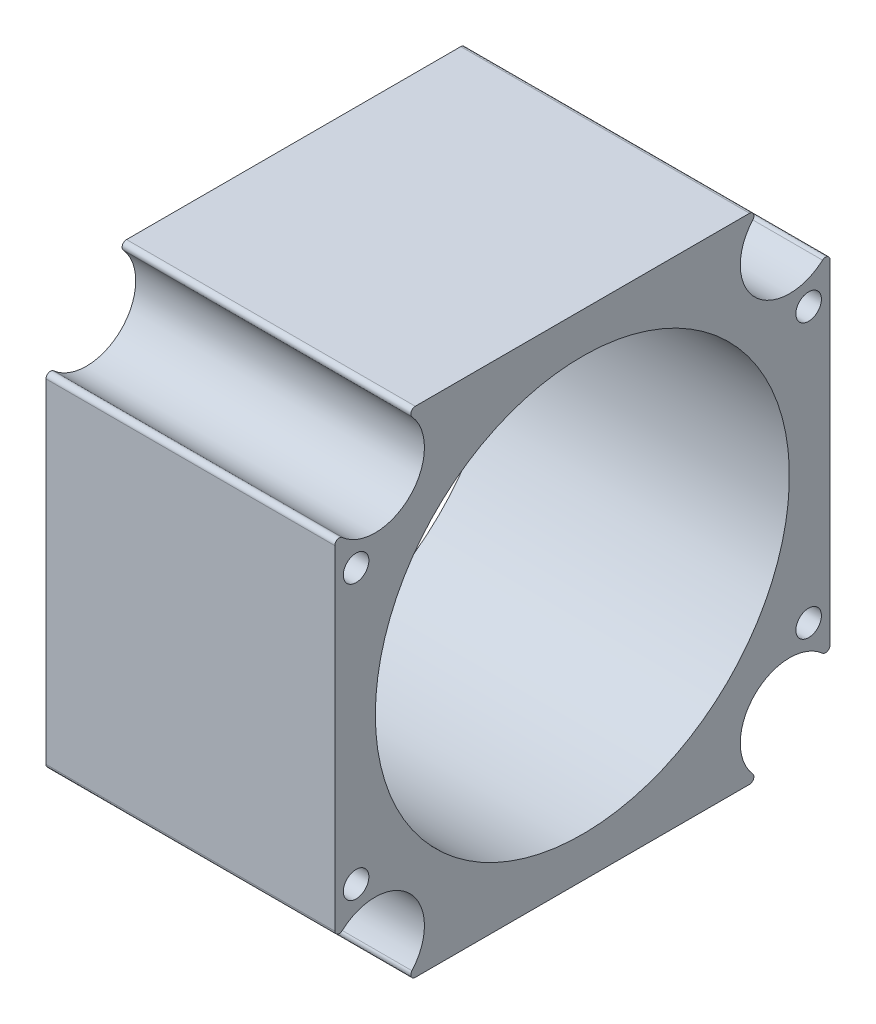
ISO-10303-21;
HEADER;
FILE_DESCRIPTION(('STEP AP214'),'2;1');
FILE_NAME('part.step','',(''),(''),'','','');
FILE_SCHEMA(('AUTOMOTIVE_DESIGN { 1 0 10303 214 1 1 1 1 }'));
ENDSEC;
DATA;
#1=APPLICATION_CONTEXT('core data for automotive mechanical design processes');
#2=APPLICATION_PROTOCOL_DEFINITION('international standard','automotive_design',2000,#1);
#3=PRODUCT_CONTEXT('',#1,'mechanical');
#4=PRODUCT('Part','Part','',(#3));
#5=PRODUCT_RELATED_PRODUCT_CATEGORY('part','',(#4));
#6=PRODUCT_DEFINITION_FORMATION('','',#4);
#7=PRODUCT_DEFINITION_CONTEXT('part definition',#1,'design');
#8=PRODUCT_DEFINITION('design','',#6,#7);
#9=PRODUCT_DEFINITION_SHAPE('','',#8);
#10=(LENGTH_UNIT() NAMED_UNIT(*) SI_UNIT(.MILLI.,.METRE.));
#11=(NAMED_UNIT(*) PLANE_ANGLE_UNIT() SI_UNIT($,.RADIAN.));
#12=(NAMED_UNIT(*) SI_UNIT($,.STERADIAN.) SOLID_ANGLE_UNIT());
#13=UNCERTAINTY_MEASURE_WITH_UNIT(LENGTH_MEASURE(1.E-05),#10,'distance_accuracy_value','');
#14=(GEOMETRIC_REPRESENTATION_CONTEXT(3) GLOBAL_UNCERTAINTY_ASSIGNED_CONTEXT((#13)) GLOBAL_UNIT_ASSIGNED_CONTEXT((#10,
#11,#12)) REPRESENTATION_CONTEXT('',''));
#15=CARTESIAN_POINT('',(0.,0.,0.));
#16=DIRECTION('',(0.,0.,1.));
#17=DIRECTION('',(1.,0.,0.));
#18=AXIS2_PLACEMENT_3D('',#15,#16,#17);
#19=CARTESIAN_POINT('',(32.766,27.559,18.9619096121272));
#20=DIRECTION('',(-1.,0.,0.));
#21=DIRECTION('',(0.,0.,1.));
#22=AXIS2_PLACEMENT_3D('',#19,#20,#21);
#23=CYLINDRICAL_SURFACE('',#22,0.508);
#24=CARTESIAN_POINT('',(0.,27.559,18.9619096121272));
#25=DIRECTION('',(1.,0.,0.));
#26=DIRECTION('',(0.,0.,-1.));
#27=AXIS2_PLACEMENT_3D('',#24,#25,#26);
#28=CIRCLE('',#27,0.508);
#29=CARTESIAN_POINT('',(0.,28.067,18.9619096121272));
#30=VERTEX_POINT('',#29);
#31=CARTESIAN_POINT('',(0.,27.2210374220374,19.3411790360159));
#32=VERTEX_POINT('',#31);
#33=EDGE_CURVE('E184',#30,#32,#28,.T.);
#34=ORIENTED_EDGE('',*,*,#33,.T.);
#35=DIRECTION('',(-1.,0.,0.));
#36=VECTOR('',#35,1.);
#37=CARTESIAN_POINT('',(32.766,27.2210374220374,19.3411790360159));
#38=LINE('',#37,#36);
#39=CARTESIAN_POINT('',(32.766,27.2210374220374,19.3411790360159));
#40=VERTEX_POINT('',#39);
#41=EDGE_CURVE('E11',#40,#32,#38,.T.);
#42=ORIENTED_EDGE('',*,*,#41,.F.);
#43=CARTESIAN_POINT('',(32.766,27.559,18.9619096121272));
#44=DIRECTION('',(1.,0.,0.));
#45=DIRECTION('',(0.,0.,-1.));
#46=AXIS2_PLACEMENT_3D('',#43,#44,#45);
#47=CIRCLE('',#46,0.508);
#48=CARTESIAN_POINT('',(32.766,28.067,18.9619096121272));
#49=VERTEX_POINT('',#48);
#50=EDGE_CURVE('E215',#49,#40,#47,.T.);
#51=ORIENTED_EDGE('',*,*,#50,.F.);
#52=DIRECTION('',(-1.,0.,0.));
#53=VECTOR('',#52,1.);
#54=CARTESIAN_POINT('',(32.766,28.067,18.9619096121272));
#55=LINE('',#54,#53);
#56=EDGE_CURVE('E180',#49,#30,#55,.T.);
#57=ORIENTED_EDGE('',*,*,#56,.T.);
#58=EDGE_LOOP('',(#34,#42,#51,#57));
#59=FACE_BOUND('',#58,.T.);
#60=ADVANCED_FACE('F40',(#59),#23,.T.);
#61=CARTESIAN_POINT('',(32.766,23.495,23.5226244343891));
#62=DIRECTION('',(-1.,0.,0.));
#63=DIRECTION('',(0.,0.,1.));
#64=AXIS2_PLACEMENT_3D('',#61,#62,#63);
#65=CYLINDRICAL_SURFACE('',#64,5.6007);
#66=CARTESIAN_POINT('',(0.,23.495,23.5226244343891));
#67=DIRECTION('',(-1.,0.,0.));
#68=DIRECTION('',(0.,0.,-1.));
#69=AXIS2_PLACEMENT_3D('',#66,#67,#68);
#70=CIRCLE('',#69,5.6007);
#71=CARTESIAN_POINT('',(0.,19.3179515766035,27.2535903895542));
#72=VERTEX_POINT('',#71);
#73=EDGE_CURVE('E187',#32,#72,#70,.T.);
#74=ORIENTED_EDGE('',*,*,#73,.T.);
#75=DIRECTION('',(-1.,0.,0.));
#76=VECTOR('',#75,1.);
#77=CARTESIAN_POINT('',(32.766,19.3179515766035,27.2535903895542));
#78=LINE('',#77,#76);
#79=CARTESIAN_POINT('',(32.766,19.3179515766035,27.2535903895542));
#80=VERTEX_POINT('',#79);
#81=EDGE_CURVE('E48',#80,#72,#78,.T.);
#82=ORIENTED_EDGE('',*,*,#81,.F.);
#83=CARTESIAN_POINT('',(32.766,23.495,23.5226244343891));
#84=DIRECTION('',(-1.,0.,0.));
#85=DIRECTION('',(0.,0.,-1.));
#86=AXIS2_PLACEMENT_3D('',#83,#84,#85);
#87=CIRCLE('',#86,5.6007);
#88=EDGE_CURVE('E123',#40,#80,#87,.T.);
#89=ORIENTED_EDGE('',*,*,#88,.F.);
#90=ORIENTED_EDGE('',*,*,#41,.T.);
#91=EDGE_LOOP('',(#74,#82,#89,#90));
#92=FACE_BOUND('',#91,.T.);
#93=ADVANCED_FACE('F314',(#92),#65,.F.);
#94=CARTESIAN_POINT('',(32.766,18.9390809713067,27.592));
#95=DIRECTION('',(-1.,0.,0.));
#96=DIRECTION('',(0.,0.,1.));
#97=AXIS2_PLACEMENT_3D('',#94,#95,#96);
#98=CYLINDRICAL_SURFACE('',#97,0.508000000000001);
#99=CARTESIAN_POINT('',(0.,18.9390809713067,27.592));
#100=DIRECTION('',(1.,0.,0.));
#101=DIRECTION('',(0.,0.,1.));
#102=AXIS2_PLACEMENT_3D('',#99,#100,#101);
#103=CIRCLE('',#102,0.508000000000001);
#104=CARTESIAN_POINT('',(0.,18.9390809713067,28.1));
#105=VERTEX_POINT('',#104);
#106=EDGE_CURVE('E190',#72,#105,#103,.T.);
#107=ORIENTED_EDGE('',*,*,#106,.T.);
#108=DIRECTION('',(-1.,0.,0.));
#109=VECTOR('',#108,1.);
#110=CARTESIAN_POINT('',(32.766,18.9390809713067,28.1));
#111=LINE('',#110,#109);
#112=CARTESIAN_POINT('',(32.766,18.9390809713067,28.1));
#113=VERTEX_POINT('',#112);
#114=EDGE_CURVE('E246',#113,#105,#111,.T.);
#115=ORIENTED_EDGE('',*,*,#114,.F.);
#116=CARTESIAN_POINT('',(32.766,18.9390809713067,27.592));
#117=DIRECTION('',(1.,0.,0.));
#118=DIRECTION('',(0.,0.,1.));
#119=AXIS2_PLACEMENT_3D('',#116,#117,#118);
#120=CIRCLE('',#119,0.508000000000001);
#121=EDGE_CURVE('E254',#80,#113,#120,.T.);
#122=ORIENTED_EDGE('',*,*,#121,.F.);
#123=ORIENTED_EDGE('',*,*,#81,.T.);
#124=EDGE_LOOP('',(#107,#115,#122,#123));
#125=FACE_BOUND('',#124,.T.);
#126=ADVANCED_FACE('F252',(#125),#98,.T.);
#127=CARTESIAN_POINT('',(32.766,-18.9390809713067,28.1));
#128=DIRECTION('',(0.,0.,-1.));
#129=DIRECTION('',(0.,1.,0.));
#130=AXIS2_PLACEMENT_3D('',#127,#128,#129);
#131=PLANE('',#130);
#132=DIRECTION('',(0.,-1.,0.));
#133=VECTOR('',#132,1.);
#134=CARTESIAN_POINT('',(0.,-18.9390809713067,28.1));
#135=LINE('',#134,#133);
#136=CARTESIAN_POINT('',(0.,-18.9390809713067,28.1));
#137=VERTEX_POINT('',#136);
#138=EDGE_CURVE('E192',#105,#137,#135,.T.);
#139=ORIENTED_EDGE('',*,*,#138,.T.);
#140=DIRECTION('',(-1.,0.,0.));
#141=VECTOR('',#140,1.);
#142=CARTESIAN_POINT('',(32.766,-18.9390809713067,28.1));
#143=LINE('',#142,#141);
#144=CARTESIAN_POINT('',(32.766,-18.9390809713067,28.1));
#145=VERTEX_POINT('',#144);
#146=EDGE_CURVE('E243',#145,#137,#143,.T.);
#147=ORIENTED_EDGE('',*,*,#146,.F.);
#148=DIRECTION('',(0.,-1.,0.));
#149=VECTOR('',#148,1.);
#150=CARTESIAN_POINT('',(32.766,-18.9390809713067,28.1));
#151=LINE('',#150,#149);
#152=EDGE_CURVE('E272',#113,#145,#151,.T.);
#153=ORIENTED_EDGE('',*,*,#152,.F.);
#154=ORIENTED_EDGE('',*,*,#114,.T.);
#155=EDGE_LOOP('',(#139,#147,#153,#154));
#156=FACE_BOUND('',#155,.T.);
#157=ADVANCED_FACE('F263',(#156),#131,.F.);
#158=CARTESIAN_POINT('',(32.766,-18.9390809713067,27.592));
#159=DIRECTION('',(-1.,0.,0.));
#160=DIRECTION('',(0.,0.,1.));
#161=AXIS2_PLACEMENT_3D('',#158,#159,#160);
#162=CYLINDRICAL_SURFACE('',#161,0.508000000000001);
#163=CARTESIAN_POINT('',(0.,-18.9390809713067,27.592));
#164=DIRECTION('',(1.,0.,0.));
#165=DIRECTION('',(0.,0.,-1.));
#166=AXIS2_PLACEMENT_3D('',#163,#164,#165);
#167=CIRCLE('',#166,0.508000000000001);
#168=CARTESIAN_POINT('',(0.,-19.3179515766035,27.2535903895542));
#169=VERTEX_POINT('',#168);
#170=EDGE_CURVE('E194',#137,#169,#167,.T.);
#171=ORIENTED_EDGE('',*,*,#170,.T.);
#172=DIRECTION('',(-1.,0.,0.));
#173=VECTOR('',#172,1.);
#174=CARTESIAN_POINT('',(32.766,-19.3179515766035,27.2535903895542));
#175=LINE('',#174,#173);
#176=CARTESIAN_POINT('',(32.766,-19.3179515766035,27.2535903895542));
#177=VERTEX_POINT('',#176);
#178=EDGE_CURVE('E240',#177,#169,#175,.T.);
#179=ORIENTED_EDGE('',*,*,#178,.F.);
#180=CARTESIAN_POINT('',(32.766,-18.9390809713067,27.592));
#181=DIRECTION('',(1.,0.,0.));
#182=DIRECTION('',(0.,0.,-1.));
#183=AXIS2_PLACEMENT_3D('',#180,#181,#182);
#184=CIRCLE('',#183,0.508000000000001);
#185=EDGE_CURVE('E269',#145,#177,#184,.T.);
#186=ORIENTED_EDGE('',*,*,#185,.F.);
#187=ORIENTED_EDGE('',*,*,#146,.T.);
#188=EDGE_LOOP('',(#171,#179,#186,#187));
#189=FACE_BOUND('',#188,.T.);
#190=ADVANCED_FACE('F267',(#189),#162,.T.);
#191=CARTESIAN_POINT('',(32.766,-23.495,23.5226244343891));
#192=DIRECTION('',(-1.,0.,0.));
#193=DIRECTION('',(0.,0.,1.));
#194=AXIS2_PLACEMENT_3D('',#191,#192,#193);
#195=CYLINDRICAL_SURFACE('',#194,5.6007);
#196=CARTESIAN_POINT('',(0.,-23.495,23.5226244343891));
#197=DIRECTION('',(-1.,0.,0.));
#198=DIRECTION('',(0.,0.,1.));
#199=AXIS2_PLACEMENT_3D('',#196,#197,#198);
#200=CIRCLE('',#199,5.6007);
#201=CARTESIAN_POINT('',(0.,-27.2210374220374,19.3411790360159));
#202=VERTEX_POINT('',#201);
#203=EDGE_CURVE('E196',#169,#202,#200,.T.);
#204=ORIENTED_EDGE('',*,*,#203,.T.);
#205=DIRECTION('',(-1.,0.,0.));
#206=VECTOR('',#205,1.);
#207=CARTESIAN_POINT('',(32.766,-27.2210374220374,19.3411790360159));
#208=LINE('',#207,#206);
#209=CARTESIAN_POINT('',(32.766,-27.2210374220374,19.3411790360159));
#210=VERTEX_POINT('',#209);
#211=EDGE_CURVE('E237',#210,#202,#208,.T.);
#212=ORIENTED_EDGE('',*,*,#211,.F.);
#213=CARTESIAN_POINT('',(32.766,-23.495,23.5226244343891));
#214=DIRECTION('',(-1.,0.,0.));
#215=DIRECTION('',(0.,0.,1.));
#216=AXIS2_PLACEMENT_3D('',#213,#214,#215);
#217=CIRCLE('',#216,5.6007);
#218=EDGE_CURVE('E271',#177,#210,#217,.T.);
#219=ORIENTED_EDGE('',*,*,#218,.F.);
#220=ORIENTED_EDGE('',*,*,#178,.T.);
#221=EDGE_LOOP('',(#204,#212,#219,#220));
#222=FACE_BOUND('',#221,.T.);
#223=ADVANCED_FACE('F327',(#222),#195,.F.);
#224=CARTESIAN_POINT('',(32.766,-27.559,18.9619096121272));
#225=DIRECTION('',(-1.,0.,0.));
#226=DIRECTION('',(0.,0.,1.));
#227=AXIS2_PLACEMENT_3D('',#224,#225,#226);
#228=CYLINDRICAL_SURFACE('',#227,0.508);
#229=CARTESIAN_POINT('',(0.,-27.559,18.9619096121272));
#230=DIRECTION('',(1.,0.,0.));
#231=DIRECTION('',(0.,0.,1.));
#232=AXIS2_PLACEMENT_3D('',#229,#230,#231);
#233=CIRCLE('',#232,0.508);
#234=CARTESIAN_POINT('',(0.,-28.067,18.9619096121272));
#235=VERTEX_POINT('',#234);
#236=EDGE_CURVE('E198',#202,#235,#233,.T.);
#237=ORIENTED_EDGE('',*,*,#236,.T.);
#238=DIRECTION('',(-1.,0.,0.));
#239=VECTOR('',#238,1.);
#240=CARTESIAN_POINT('',(32.766,-28.067,18.9619096121272));
#241=LINE('',#240,#239);
#242=CARTESIAN_POINT('',(32.766,-28.067,18.9619096121272));
#243=VERTEX_POINT('',#242);
#244=EDGE_CURVE('E234',#243,#235,#241,.T.);
#245=ORIENTED_EDGE('',*,*,#244,.F.);
#246=CARTESIAN_POINT('',(32.766,-27.559,18.9619096121272));
#247=DIRECTION('',(1.,0.,0.));
#248=DIRECTION('',(0.,0.,1.));
#249=AXIS2_PLACEMENT_3D('',#246,#247,#248);
#250=CIRCLE('',#249,0.508);
#251=EDGE_CURVE('E274',#210,#243,#250,.T.);
#252=ORIENTED_EDGE('',*,*,#251,.F.);
#253=ORIENTED_EDGE('',*,*,#211,.T.);
#254=EDGE_LOOP('',(#237,#245,#252,#253));
#255=FACE_BOUND('',#254,.T.);
#256=ADVANCED_FACE('F330',(#255),#228,.T.);
#257=CARTESIAN_POINT('',(32.766,-28.067,18.9619096121272));
#258=DIRECTION('',(0.,1.,0.));
#259=DIRECTION('',(0.,0.,1.));
#260=AXIS2_PLACEMENT_3D('',#257,#258,#259);
#261=PLANE('',#260);
#262=DIRECTION('',(0.,0.,-1.));
#263=VECTOR('',#262,1.);
#264=CARTESIAN_POINT('',(0.,-28.067,18.9619096121272));
#265=LINE('',#264,#263);
#266=CARTESIAN_POINT('',(0.,-28.067,-18.9619096121272));
#267=VERTEX_POINT('',#266);
#268=EDGE_CURVE('E200',#235,#267,#265,.T.);
#269=ORIENTED_EDGE('',*,*,#268,.T.);
#270=DIRECTION('',(-1.,0.,0.));
#271=VECTOR('',#270,1.);
#272=CARTESIAN_POINT('',(32.766,-28.067,-18.9619096121272));
#273=LINE('',#272,#271);
#274=CARTESIAN_POINT('',(32.766,-28.067,-18.9619096121272));
#275=VERTEX_POINT('',#274);
#276=EDGE_CURVE('E231',#275,#267,#273,.T.);
#277=ORIENTED_EDGE('',*,*,#276,.F.);
#278=DIRECTION('',(0.,0.,-1.));
#279=VECTOR('',#278,1.);
#280=CARTESIAN_POINT('',(32.766,-28.067,18.9619096121272));
#281=LINE('',#280,#279);
#282=EDGE_CURVE('E280',#243,#275,#281,.T.);
#283=ORIENTED_EDGE('',*,*,#282,.F.);
#284=ORIENTED_EDGE('',*,*,#244,.T.);
#285=EDGE_LOOP('',(#269,#277,#283,#284));
#286=FACE_BOUND('',#285,.T.);
#287=ADVANCED_FACE('F334',(#286),#261,.F.);
#288=CARTESIAN_POINT('',(32.766,-27.559,-18.9619096121272));
#289=DIRECTION('',(-1.,0.,0.));
#290=DIRECTION('',(0.,0.,1.));
#291=AXIS2_PLACEMENT_3D('',#288,#289,#290);
#292=CYLINDRICAL_SURFACE('',#291,0.508);
#293=CARTESIAN_POINT('',(0.,-27.559,-18.9619096121272));
#294=DIRECTION('',(1.,0.,0.));
#295=DIRECTION('',(0.,0.,-1.));
#296=AXIS2_PLACEMENT_3D('',#293,#294,#295);
#297=CIRCLE('',#296,0.508);
#298=CARTESIAN_POINT('',(0.,-27.2210374220374,-19.3411790360159));
#299=VERTEX_POINT('',#298);
#300=EDGE_CURVE('E202',#267,#299,#297,.T.);
#301=ORIENTED_EDGE('',*,*,#300,.T.);
#302=DIRECTION('',(-1.,0.,0.));
#303=VECTOR('',#302,1.);
#304=CARTESIAN_POINT('',(32.766,-27.2210374220374,-19.3411790360159));
#305=LINE('',#304,#303);
#306=CARTESIAN_POINT('',(32.766,-27.2210374220374,-19.3411790360159));
#307=VERTEX_POINT('',#306);
#308=EDGE_CURVE('E228',#307,#299,#305,.T.);
#309=ORIENTED_EDGE('',*,*,#308,.F.);
#310=CARTESIAN_POINT('',(32.766,-27.559,-18.9619096121272));
#311=DIRECTION('',(1.,0.,0.));
#312=DIRECTION('',(0.,0.,-1.));
#313=AXIS2_PLACEMENT_3D('',#310,#311,#312);
#314=CIRCLE('',#313,0.508);
#315=EDGE_CURVE('E282',#275,#307,#314,.T.);
#316=ORIENTED_EDGE('',*,*,#315,.F.);
#317=ORIENTED_EDGE('',*,*,#276,.T.);
#318=EDGE_LOOP('',(#301,#309,#316,#317));
#319=FACE_BOUND('',#318,.T.);
#320=ADVANCED_FACE('F338',(#319),#292,.T.);
#321=CARTESIAN_POINT('',(32.766,-23.495,-23.5226244343892));
#322=DIRECTION('',(-1.,0.,0.));
#323=DIRECTION('',(0.,0.,1.));
#324=AXIS2_PLACEMENT_3D('',#321,#322,#323);
#325=CYLINDRICAL_SURFACE('',#324,5.6007);
#326=CARTESIAN_POINT('',(0.,-23.495,-23.5226244343892));
#327=DIRECTION('',(-1.,0.,0.));
#328=DIRECTION('',(0.,0.,-1.));
#329=AXIS2_PLACEMENT_3D('',#326,#327,#328);
#330=CIRCLE('',#329,5.6007);
#331=CARTESIAN_POINT('',(0.,-19.3179515766035,-27.2535903895542));
#332=VERTEX_POINT('',#331);
#333=EDGE_CURVE('E204',#299,#332,#330,.T.);
#334=ORIENTED_EDGE('',*,*,#333,.T.);
#335=DIRECTION('',(-1.,0.,0.));
#336=VECTOR('',#335,1.);
#337=CARTESIAN_POINT('',(32.766,-19.3179515766035,-27.2535903895542));
#338=LINE('',#337,#336);
#339=CARTESIAN_POINT('',(32.766,-19.3179515766035,-27.2535903895542));
#340=VERTEX_POINT('',#339);
#341=EDGE_CURVE('E225',#340,#332,#338,.T.);
#342=ORIENTED_EDGE('',*,*,#341,.F.);
#343=CARTESIAN_POINT('',(32.766,-23.495,-23.5226244343892));
#344=DIRECTION('',(-1.,0.,0.));
#345=DIRECTION('',(0.,0.,-1.));
#346=AXIS2_PLACEMENT_3D('',#343,#344,#345);
#347=CIRCLE('',#346,5.6007);
#348=EDGE_CURVE('E284',#307,#340,#347,.T.);
#349=ORIENTED_EDGE('',*,*,#348,.F.);
#350=ORIENTED_EDGE('',*,*,#308,.T.);
#351=EDGE_LOOP('',(#334,#342,#349,#350));
#352=FACE_BOUND('',#351,.T.);
#353=ADVANCED_FACE('F342',(#352),#325,.F.);
#354=CARTESIAN_POINT('',(32.766,-18.9390809713067,-27.592));
#355=DIRECTION('',(-1.,0.,0.));
#356=DIRECTION('',(0.,0.,1.));
#357=AXIS2_PLACEMENT_3D('',#354,#355,#356);
#358=CYLINDRICAL_SURFACE('',#357,0.508000000000001);
#359=CARTESIAN_POINT('',(0.,-18.9390809713067,-27.592));
#360=DIRECTION('',(1.,0.,0.));
#361=DIRECTION('',(0.,0.,1.));
#362=AXIS2_PLACEMENT_3D('',#359,#360,#361);
#363=CIRCLE('',#362,0.508000000000001);
#364=CARTESIAN_POINT('',(0.,-18.9390809713067,-28.1));
#365=VERTEX_POINT('',#364);
#366=EDGE_CURVE('E206',#332,#365,#363,.T.);
#367=ORIENTED_EDGE('',*,*,#366,.T.);
#368=DIRECTION('',(-1.,0.,0.));
#369=VECTOR('',#368,1.);
#370=CARTESIAN_POINT('',(32.766,-18.9390809713067,-28.1));
#371=LINE('',#370,#369);
#372=CARTESIAN_POINT('',(32.766,-18.9390809713067,-28.1));
#373=VERTEX_POINT('',#372);
#374=EDGE_CURVE('E222',#373,#365,#371,.T.);
#375=ORIENTED_EDGE('',*,*,#374,.F.);
#376=CARTESIAN_POINT('',(32.766,-18.9390809713067,-27.592));
#377=DIRECTION('',(1.,0.,0.));
#378=DIRECTION('',(0.,0.,1.));
#379=AXIS2_PLACEMENT_3D('',#376,#377,#378);
#380=CIRCLE('',#379,0.508000000000001);
#381=EDGE_CURVE('E286',#340,#373,#380,.T.);
#382=ORIENTED_EDGE('',*,*,#381,.F.);
#383=ORIENTED_EDGE('',*,*,#341,.T.);
#384=EDGE_LOOP('',(#367,#375,#382,#383));
#385=FACE_BOUND('',#384,.T.);
#386=ADVANCED_FACE('F346',(#385),#358,.T.);
#387=CARTESIAN_POINT('',(32.766,-18.9390809713067,-28.1));
#388=DIRECTION('',(0.,0.,1.));
#389=DIRECTION('',(0.,-1.,0.));
#390=AXIS2_PLACEMENT_3D('',#387,#388,#389);
#391=PLANE('',#390);
#392=DIRECTION('',(0.,1.,0.));
#393=VECTOR('',#392,1.);
#394=CARTESIAN_POINT('',(0.,-18.9390809713067,-28.1));
#395=LINE('',#394,#393);
#396=CARTESIAN_POINT('',(0.,18.9390809713067,-28.1));
#397=VERTEX_POINT('',#396);
#398=EDGE_CURVE('E208',#365,#397,#395,.T.);
#399=ORIENTED_EDGE('',*,*,#398,.T.);
#400=DIRECTION('',(-1.,0.,0.));
#401=VECTOR('',#400,1.);
#402=CARTESIAN_POINT('',(32.766,18.9390809713067,-28.1));
#403=LINE('',#402,#401);
#404=CARTESIAN_POINT('',(32.766,18.9390809713067,-28.1));
#405=VERTEX_POINT('',#404);
#406=EDGE_CURVE('E219',#405,#397,#403,.T.);
#407=ORIENTED_EDGE('',*,*,#406,.F.);
#408=DIRECTION('',(0.,1.,0.));
#409=VECTOR('',#408,1.);
#410=CARTESIAN_POINT('',(32.766,-18.9390809713067,-28.1));
#411=LINE('',#410,#409);
#412=EDGE_CURVE('E288',#373,#405,#411,.T.);
#413=ORIENTED_EDGE('',*,*,#412,.F.);
#414=ORIENTED_EDGE('',*,*,#374,.T.);
#415=EDGE_LOOP('',(#399,#407,#413,#414));
#416=FACE_BOUND('',#415,.T.);
#417=ADVANCED_FACE('F294',(#416),#391,.F.);
#418=CARTESIAN_POINT('',(32.766,18.9390809713067,-27.592));
#419=DIRECTION('',(-1.,0.,0.));
#420=DIRECTION('',(0.,0.,1.));
#421=AXIS2_PLACEMENT_3D('',#418,#419,#420);
#422=CYLINDRICAL_SURFACE('',#421,0.508000000000001);
#423=CARTESIAN_POINT('',(0.,18.9390809713067,-27.592));
#424=DIRECTION('',(1.,0.,0.));
#425=DIRECTION('',(0.,0.,-1.));
#426=AXIS2_PLACEMENT_3D('',#423,#424,#425);
#427=CIRCLE('',#426,0.508000000000001);
#428=CARTESIAN_POINT('',(0.,19.3179515766035,-27.2535903895542));
#429=VERTEX_POINT('',#428);
#430=EDGE_CURVE('E210',#397,#429,#427,.T.);
#431=ORIENTED_EDGE('',*,*,#430,.T.);
#432=DIRECTION('',(-1.,0.,0.));
#433=VECTOR('',#432,1.);
#434=CARTESIAN_POINT('',(32.766,19.3179515766035,-27.2535903895542));
#435=LINE('',#434,#433);
#436=CARTESIAN_POINT('',(32.766,19.3179515766035,-27.2535903895542));
#437=VERTEX_POINT('',#436);
#438=EDGE_CURVE('E175',#437,#429,#435,.T.);
#439=ORIENTED_EDGE('',*,*,#438,.F.);
#440=CARTESIAN_POINT('',(32.766,18.9390809713067,-27.592));
#441=DIRECTION('',(1.,0.,0.));
#442=DIRECTION('',(0.,0.,-1.));
#443=AXIS2_PLACEMENT_3D('',#440,#441,#442);
#444=CIRCLE('',#443,0.508000000000001);
#445=EDGE_CURVE('E166',#405,#437,#444,.T.);
#446=ORIENTED_EDGE('',*,*,#445,.F.);
#447=ORIENTED_EDGE('',*,*,#406,.T.);
#448=EDGE_LOOP('',(#431,#439,#446,#447));
#449=FACE_BOUND('',#448,.T.);
#450=ADVANCED_FACE('F298',(#449),#422,.T.);
#451=CARTESIAN_POINT('',(32.766,23.495,-23.5226244343891));
#452=DIRECTION('',(-1.,0.,0.));
#453=DIRECTION('',(0.,0.,1.));
#454=AXIS2_PLACEMENT_3D('',#451,#452,#453);
#455=CYLINDRICAL_SURFACE('',#454,5.6007);
#456=CARTESIAN_POINT('',(0.,23.495,-23.5226244343891));
#457=DIRECTION('',(-1.,0.,0.));
#458=DIRECTION('',(0.,0.,1.));
#459=AXIS2_PLACEMENT_3D('',#456,#457,#458);
#460=CIRCLE('',#459,5.6007);
#461=CARTESIAN_POINT('',(0.,27.2210374220374,-19.3411790360159));
#462=VERTEX_POINT('',#461);
#463=EDGE_CURVE('E174',#429,#462,#460,.T.);
#464=ORIENTED_EDGE('',*,*,#463,.T.);
#465=DIRECTION('',(-1.,0.,0.));
#466=VECTOR('',#465,1.);
#467=CARTESIAN_POINT('',(32.766,27.2210374220374,-19.3411790360159));
#468=LINE('',#467,#466);
#469=CARTESIAN_POINT('',(32.766,27.2210374220374,-19.3411790360159));
#470=VERTEX_POINT('',#469);
#471=EDGE_CURVE('E171',#470,#462,#468,.T.);
#472=ORIENTED_EDGE('',*,*,#471,.F.);
#473=CARTESIAN_POINT('',(32.766,23.495,-23.5226244343891));
#474=DIRECTION('',(-1.,0.,0.));
#475=DIRECTION('',(0.,0.,1.));
#476=AXIS2_PLACEMENT_3D('',#473,#474,#475);
#477=CIRCLE('',#476,5.6007);
#478=EDGE_CURVE('E160',#437,#470,#477,.T.);
#479=ORIENTED_EDGE('',*,*,#478,.F.);
#480=ORIENTED_EDGE('',*,*,#438,.T.);
#481=EDGE_LOOP('',(#464,#472,#479,#480));
#482=FACE_BOUND('',#481,.T.);
#483=ADVANCED_FACE('F172',(#482),#455,.F.);
#484=CARTESIAN_POINT('',(32.766,27.559,-18.9619096121272));
#485=DIRECTION('',(-1.,0.,0.));
#486=DIRECTION('',(0.,0.,1.));
#487=AXIS2_PLACEMENT_3D('',#484,#485,#486);
#488=CYLINDRICAL_SURFACE('',#487,0.508);
#489=CARTESIAN_POINT('',(0.,27.559,-18.9619096121272));
#490=DIRECTION('',(1.,0.,0.));
#491=DIRECTION('',(0.,0.,1.));
#492=AXIS2_PLACEMENT_3D('',#489,#490,#491);
#493=CIRCLE('',#492,0.508);
#494=CARTESIAN_POINT('',(0.,28.067,-18.9619096121272));
#495=VERTEX_POINT('',#494);
#496=EDGE_CURVE('E109',#462,#495,#493,.T.);
#497=ORIENTED_EDGE('',*,*,#496,.T.);
#498=DIRECTION('',(-1.,0.,0.));
#499=VECTOR('',#498,1.);
#500=CARTESIAN_POINT('',(32.766,28.067,-18.9619096121272));
#501=LINE('',#500,#499);
#502=CARTESIAN_POINT('',(32.766,28.067,-18.9619096121272));
#503=VERTEX_POINT('',#502);
#504=EDGE_CURVE('E176',#503,#495,#501,.T.);
#505=ORIENTED_EDGE('',*,*,#504,.F.);
#506=CARTESIAN_POINT('',(32.766,27.559,-18.9619096121272));
#507=DIRECTION('',(1.,0.,0.));
#508=DIRECTION('',(0.,0.,1.));
#509=AXIS2_PLACEMENT_3D('',#506,#507,#508);
#510=CIRCLE('',#509,0.508);
#511=EDGE_CURVE('E164',#470,#503,#510,.T.);
#512=ORIENTED_EDGE('',*,*,#511,.F.);
#513=ORIENTED_EDGE('',*,*,#471,.T.);
#514=EDGE_LOOP('',(#497,#505,#512,#513));
#515=FACE_BOUND('',#514,.T.);
#516=ADVANCED_FACE('F178',(#515),#488,.T.);
#517=CARTESIAN_POINT('',(32.766,28.067,18.9619096121272));
#518=DIRECTION('',(0.,-1.,0.));
#519=DIRECTION('',(0.,0.,-1.));
#520=AXIS2_PLACEMENT_3D('',#517,#518,#519);
#521=PLANE('',#520);
#522=DIRECTION('',(0.,0.,1.));
#523=VECTOR('',#522,1.);
#524=CARTESIAN_POINT('',(0.,28.067,18.9619096121272));
#525=LINE('',#524,#523);
#526=EDGE_CURVE('E115',#495,#30,#525,.T.);
#527=ORIENTED_EDGE('',*,*,#526,.T.);
#528=ORIENTED_EDGE('',*,*,#56,.F.);
#529=DIRECTION('',(0.,0.,1.));
#530=VECTOR('',#529,1.);
#531=CARTESIAN_POINT('',(32.766,28.067,18.9619096121272));
#532=LINE('',#531,#530);
#533=EDGE_CURVE('E56',#503,#49,#532,.T.);
#534=ORIENTED_EDGE('',*,*,#533,.F.);
#535=ORIENTED_EDGE('',*,*,#504,.T.);
#536=EDGE_LOOP('',(#527,#528,#534,#535));
#537=FACE_BOUND('',#536,.T.);
#538=ADVANCED_FACE('F302',(#537),#521,.F.);
#539=CARTESIAN_POINT('',(32.766,27.559,18.9619096121272));
#540=DIRECTION('',(1.,0.,0.));
#541=DIRECTION('',(0.,0.,-1.));
#542=AXIS2_PLACEMENT_3D('',#539,#540,#541);
#543=PLANE('',#542);
#544=CARTESIAN_POINT('',(32.766,15.544299781527,-25.6794));
#545=DIRECTION('',(1.,0.,0.));
#546=DIRECTION('',(0.,0.,-1.));
#547=AXIS2_PLACEMENT_3D('',#544,#545,#546);
#548=CIRCLE('',#547,1.44999999999999);
#549=CARTESIAN_POINT('',(32.766,15.544299781527,-27.1294));
#550=VERTEX_POINT('',#549);
#551=EDGE_CURVE('E450',#550,#550,#548,.T.);
#552=ORIENTED_EDGE('',*,*,#551,.F.);
#553=EDGE_LOOP('',(#552));
#554=FACE_BOUND('',#553,.T.);
#555=CARTESIAN_POINT('',(32.766,-15.544299781527,-25.6794));
#556=DIRECTION('',(1.,0.,0.));
#557=DIRECTION('',(0.,0.,-1.));
#558=AXIS2_PLACEMENT_3D('',#555,#556,#557);
#559=CIRCLE('',#558,1.44999999999999);
#560=CARTESIAN_POINT('',(32.766,-15.544299781527,-27.1294));
#561=VERTEX_POINT('',#560);
#562=EDGE_CURVE('E452',#561,#561,#559,.T.);
#563=ORIENTED_EDGE('',*,*,#562,.F.);
#564=EDGE_LOOP('',(#563));
#565=FACE_BOUND('',#564,.T.);
#566=CARTESIAN_POINT('',(32.766,15.544299781527,25.6794));
#567=DIRECTION('',(1.,0.,0.));
#568=DIRECTION('',(0.,0.,-1.));
#569=AXIS2_PLACEMENT_3D('',#566,#567,#568);
#570=CIRCLE('',#569,1.44999999999999);
#571=CARTESIAN_POINT('',(32.766,15.544299781527,24.2294));
#572=VERTEX_POINT('',#571);
#573=EDGE_CURVE('E460',#572,#572,#570,.T.);
#574=ORIENTED_EDGE('',*,*,#573,.F.);
#575=EDGE_LOOP('',(#574));
#576=FACE_BOUND('',#575,.T.);
#577=CARTESIAN_POINT('',(32.766,-15.544299781527,25.6794));
#578=DIRECTION('',(1.,0.,0.));
#579=DIRECTION('',(0.,0.,-1.));
#580=AXIS2_PLACEMENT_3D('',#577,#578,#579);
#581=CIRCLE('',#580,1.44999999999999);
#582=CARTESIAN_POINT('',(32.766,-15.544299781527,24.2294));
#583=VERTEX_POINT('',#582);
#584=EDGE_CURVE('E466',#583,#583,#581,.T.);
#585=ORIENTED_EDGE('',*,*,#584,.F.);
#586=EDGE_LOOP('',(#585));
#587=FACE_BOUND('',#586,.T.);
#588=CARTESIAN_POINT('',(32.766,0.,0.));
#589=DIRECTION('',(-1.,0.,0.));
#590=DIRECTION('',(0.,0.,1.));
#591=AXIS2_PLACEMENT_3D('',#588,#589,#590);
#592=CIRCLE('',#591,23.495);
#593=CARTESIAN_POINT('',(32.766,0.,23.495));
#594=VERTEX_POINT('',#593);
#595=EDGE_CURVE('E188',#594,#594,#592,.T.);
#596=ORIENTED_EDGE('',*,*,#595,.T.);
#597=EDGE_LOOP('',(#596));
#598=FACE_BOUND('',#597,.T.);
#599=ORIENTED_EDGE('',*,*,#50,.T.);
#600=ORIENTED_EDGE('',*,*,#88,.T.);
#601=ORIENTED_EDGE('',*,*,#121,.T.);
#602=ORIENTED_EDGE('',*,*,#152,.T.);
#603=ORIENTED_EDGE('',*,*,#185,.T.);
#604=ORIENTED_EDGE('',*,*,#218,.T.);
#605=ORIENTED_EDGE('',*,*,#251,.T.);
#606=ORIENTED_EDGE('',*,*,#282,.T.);
#607=ORIENTED_EDGE('',*,*,#315,.T.);
#608=ORIENTED_EDGE('',*,*,#348,.T.);
#609=ORIENTED_EDGE('',*,*,#381,.T.);
#610=ORIENTED_EDGE('',*,*,#412,.T.);
#611=ORIENTED_EDGE('',*,*,#445,.T.);
#612=ORIENTED_EDGE('',*,*,#478,.T.);
#613=ORIENTED_EDGE('',*,*,#511,.T.);
#614=ORIENTED_EDGE('',*,*,#533,.T.);
#615=EDGE_LOOP('',(#599,#600,#601,#602,#603,#604,#605,#606,#607,#608,#609,#610,#611,#612,#613,#614));
#616=FACE_BOUND('',#615,.T.);
#617=ADVANCED_FACE('F162',(#554,#565,#576,#587,#598,#616),#543,.T.);
#618=CARTESIAN_POINT('',(0.,27.559,18.9619096121272));
#619=DIRECTION('',(1.,0.,0.));
#620=DIRECTION('',(0.,0.,-1.));
#621=AXIS2_PLACEMENT_3D('',#618,#619,#620);
#622=PLANE('',#621);
#623=CARTESIAN_POINT('',(0.,15.544299781527,-25.6794));
#624=DIRECTION('',(1.,0.,0.));
#625=DIRECTION('',(0.,0.,-1.));
#626=AXIS2_PLACEMENT_3D('',#623,#624,#625);
#627=CIRCLE('',#626,1.44999999999999);
#628=CARTESIAN_POINT('',(0.,15.544299781527,-27.1294));
#629=VERTEX_POINT('',#628);
#630=EDGE_CURVE('E447',#629,#629,#627,.T.);
#631=ORIENTED_EDGE('',*,*,#630,.T.);
#632=EDGE_LOOP('',(#631));
#633=FACE_BOUND('',#632,.T.);
#634=CARTESIAN_POINT('',(0.,-15.544299781527,-25.6794));
#635=DIRECTION('',(1.,0.,0.));
#636=DIRECTION('',(0.,0.,-1.));
#637=AXIS2_PLACEMENT_3D('',#634,#635,#636);
#638=CIRCLE('',#637,1.44999999999999);
#639=CARTESIAN_POINT('',(0.,-15.544299781527,-27.1294));
#640=VERTEX_POINT('',#639);
#641=EDGE_CURVE('E457',#640,#640,#638,.T.);
#642=ORIENTED_EDGE('',*,*,#641,.T.);
#643=EDGE_LOOP('',(#642));
#644=FACE_BOUND('',#643,.T.);
#645=CARTESIAN_POINT('',(0.,15.544299781527,25.6794));
#646=DIRECTION('',(1.,0.,0.));
#647=DIRECTION('',(0.,0.,-1.));
#648=AXIS2_PLACEMENT_3D('',#645,#646,#647);
#649=CIRCLE('',#648,1.44999999999999);
#650=CARTESIAN_POINT('',(0.,15.544299781527,24.2294));
#651=VERTEX_POINT('',#650);
#652=EDGE_CURVE('E463',#651,#651,#649,.T.);
#653=ORIENTED_EDGE('',*,*,#652,.T.);
#654=EDGE_LOOP('',(#653));
#655=FACE_BOUND('',#654,.T.);
#656=CARTESIAN_POINT('',(0.,-15.544299781527,25.6794));
#657=DIRECTION('',(1.,0.,0.));
#658=DIRECTION('',(0.,0.,-1.));
#659=AXIS2_PLACEMENT_3D('',#656,#657,#658);
#660=CIRCLE('',#659,1.44999999999999);
#661=CARTESIAN_POINT('',(0.,-15.544299781527,24.2294));
#662=VERTEX_POINT('',#661);
#663=EDGE_CURVE('E469',#662,#662,#660,.T.);
#664=ORIENTED_EDGE('',*,*,#663,.T.);
#665=EDGE_LOOP('',(#664));
#666=FACE_BOUND('',#665,.T.);
#667=CARTESIAN_POINT('',(0.,0.,0.));
#668=DIRECTION('',(-1.,0.,0.));
#669=DIRECTION('',(0.,0.,1.));
#670=AXIS2_PLACEMENT_3D('',#667,#668,#669);
#671=CIRCLE('',#670,23.495);
#672=CARTESIAN_POINT('',(0.,0.,23.495));
#673=VERTEX_POINT('',#672);
#674=EDGE_CURVE('E472',#673,#673,#671,.T.);
#675=ORIENTED_EDGE('',*,*,#674,.F.);
#676=EDGE_LOOP('',(#675));
#677=FACE_BOUND('',#676,.T.);
#678=ORIENTED_EDGE('',*,*,#33,.F.);
#679=ORIENTED_EDGE('',*,*,#526,.F.);
#680=ORIENTED_EDGE('',*,*,#496,.F.);
#681=ORIENTED_EDGE('',*,*,#463,.F.);
#682=ORIENTED_EDGE('',*,*,#430,.F.);
#683=ORIENTED_EDGE('',*,*,#398,.F.);
#684=ORIENTED_EDGE('',*,*,#366,.F.);
#685=ORIENTED_EDGE('',*,*,#333,.F.);
#686=ORIENTED_EDGE('',*,*,#300,.F.);
#687=ORIENTED_EDGE('',*,*,#268,.F.);
#688=ORIENTED_EDGE('',*,*,#236,.F.);
#689=ORIENTED_EDGE('',*,*,#203,.F.);
#690=ORIENTED_EDGE('',*,*,#170,.F.);
#691=ORIENTED_EDGE('',*,*,#138,.F.);
#692=ORIENTED_EDGE('',*,*,#106,.F.);
#693=ORIENTED_EDGE('',*,*,#73,.F.);
#694=EDGE_LOOP('',(#678,#679,#680,#681,#682,#683,#684,#685,#686,#687,#688,#689,#690,#691,#692,#693));
#695=FACE_BOUND('',#694,.T.);
#696=ADVANCED_FACE('F258',(#633,#644,#655,#666,#677,#695),#622,.F.);
#697=CARTESIAN_POINT('',(32.766,0.,0.));
#698=DIRECTION('',(-1.,0.,0.));
#699=DIRECTION('',(0.,0.,1.));
#700=AXIS2_PLACEMENT_3D('',#697,#698,#699);
#701=CYLINDRICAL_SURFACE('',#700,23.495);
#702=ORIENTED_EDGE('',*,*,#595,.F.);
#703=EDGE_LOOP('',(#702));
#704=FACE_BOUND('',#703,.T.);
#705=ORIENTED_EDGE('',*,*,#674,.T.);
#706=EDGE_LOOP('',(#705));
#707=FACE_BOUND('',#706,.T.);
#708=ADVANCED_FACE('F374',(#704,#707),#701,.F.);
#709=CARTESIAN_POINT('',(32.766,-15.544299781527,25.6794));
#710=DIRECTION('',(1.,0.,0.));
#711=DIRECTION('',(0.,0.,-1.));
#712=AXIS2_PLACEMENT_3D('',#709,#710,#711);
#713=CYLINDRICAL_SURFACE('',#712,1.44999999999999);
#714=ORIENTED_EDGE('',*,*,#663,.F.);
#715=EDGE_LOOP('',(#714));
#716=FACE_BOUND('',#715,.T.);
#717=ORIENTED_EDGE('',*,*,#584,.T.);
#718=EDGE_LOOP('',(#717));
#719=FACE_BOUND('',#718,.T.);
#720=ADVANCED_FACE('F379',(#716,#719),#713,.F.);
#721=CARTESIAN_POINT('',(32.766,15.544299781527,25.6794));
#722=DIRECTION('',(1.,0.,0.));
#723=DIRECTION('',(0.,0.,-1.));
#724=AXIS2_PLACEMENT_3D('',#721,#722,#723);
#725=CYLINDRICAL_SURFACE('',#724,1.44999999999999);
#726=ORIENTED_EDGE('',*,*,#652,.F.);
#727=EDGE_LOOP('',(#726));
#728=FACE_BOUND('',#727,.T.);
#729=ORIENTED_EDGE('',*,*,#573,.T.);
#730=EDGE_LOOP('',(#729));
#731=FACE_BOUND('',#730,.T.);
#732=ADVANCED_FACE('F403',(#728,#731),#725,.F.);
#733=CARTESIAN_POINT('',(32.766,-15.544299781527,-25.6794));
#734=DIRECTION('',(1.,0.,0.));
#735=DIRECTION('',(0.,0.,-1.));
#736=AXIS2_PLACEMENT_3D('',#733,#734,#735);
#737=CYLINDRICAL_SURFACE('',#736,1.44999999999999);
#738=ORIENTED_EDGE('',*,*,#641,.F.);
#739=EDGE_LOOP('',(#738));
#740=FACE_BOUND('',#739,.T.);
#741=ORIENTED_EDGE('',*,*,#562,.T.);
#742=EDGE_LOOP('',(#741));
#743=FACE_BOUND('',#742,.T.);
#744=ADVANCED_FACE('F414',(#740,#743),#737,.F.);
#745=CARTESIAN_POINT('',(32.766,15.544299781527,-25.6794));
#746=DIRECTION('',(1.,0.,0.));
#747=DIRECTION('',(0.,0.,-1.));
#748=AXIS2_PLACEMENT_3D('',#745,#746,#747);
#749=CYLINDRICAL_SURFACE('',#748,1.44999999999999);
#750=ORIENTED_EDGE('',*,*,#630,.F.);
#751=EDGE_LOOP('',(#750));
#752=FACE_BOUND('',#751,.T.);
#753=ORIENTED_EDGE('',*,*,#551,.T.);
#754=EDGE_LOOP('',(#753));
#755=FACE_BOUND('',#754,.T.);
#756=ADVANCED_FACE('F425',(#752,#755),#749,.F.);
#757=CLOSED_SHELL('',(#60,#93,#126,#157,#190,#223,#256,#287,#320,#353,#386,#417,#450,#483,#516,
#538,#617,#696,#708,#720,#732,#744,#756));
#758=MANIFOLD_SOLID_BREP('B2',#757);
#759=ADVANCED_BREP_SHAPE_REPRESENTATION('',(#18,#758),#14);
#760=SHAPE_DEFINITION_REPRESENTATION(#9,#759);
ENDSEC;
END-ISO-10303-21;
